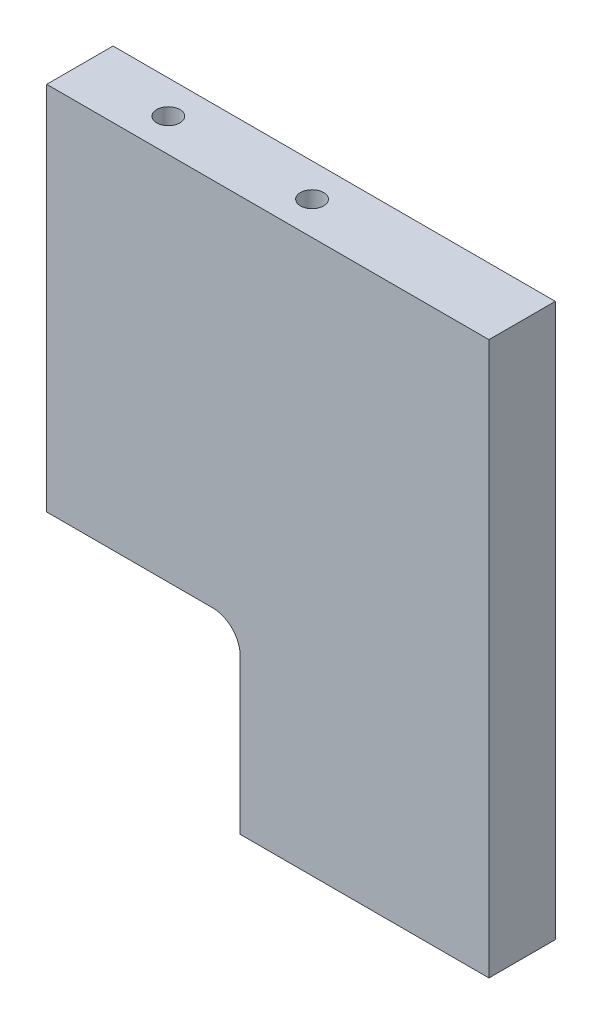
ISO-10303-21;
HEADER;
FILE_DESCRIPTION(('STEP AP214'),'2;1');
FILE_NAME('part.step','',(''),(''),'','','');
FILE_SCHEMA(('AUTOMOTIVE_DESIGN { 1 0 10303 214 1 1 1 1 }'));
ENDSEC;
DATA;
#1=APPLICATION_CONTEXT('core data for automotive mechanical design processes');
#2=APPLICATION_PROTOCOL_DEFINITION('international standard','automotive_design',2000,#1);
#3=PRODUCT_CONTEXT('',#1,'mechanical');
#4=PRODUCT('Part','Part','',(#3));
#5=PRODUCT_RELATED_PRODUCT_CATEGORY('part','',(#4));
#6=PRODUCT_DEFINITION_FORMATION('','',#4);
#7=PRODUCT_DEFINITION_CONTEXT('part definition',#1,'design');
#8=PRODUCT_DEFINITION('design','',#6,#7);
#9=PRODUCT_DEFINITION_SHAPE('','',#8);
#10=(LENGTH_UNIT() NAMED_UNIT(*) SI_UNIT(.MILLI.,.METRE.));
#11=(NAMED_UNIT(*) PLANE_ANGLE_UNIT() SI_UNIT($,.RADIAN.));
#12=(NAMED_UNIT(*) SI_UNIT($,.STERADIAN.) SOLID_ANGLE_UNIT());
#13=UNCERTAINTY_MEASURE_WITH_UNIT(LENGTH_MEASURE(1.E-05),#10,'distance_accuracy_value','');
#14=(GEOMETRIC_REPRESENTATION_CONTEXT(3) GLOBAL_UNCERTAINTY_ASSIGNED_CONTEXT((#13)) GLOBAL_UNIT_ASSIGNED_CONTEXT((#10,
#11,#12)) REPRESENTATION_CONTEXT('',''));
#15=CARTESIAN_POINT('',(0.,0.,0.));
#16=DIRECTION('',(0.,0.,1.));
#17=DIRECTION('',(1.,0.,0.));
#18=AXIS2_PLACEMENT_3D('',#15,#16,#17);
#19=CARTESIAN_POINT('',(0.,100.,12.));
#20=DIRECTION('',(-1.,0.,0.));
#21=DIRECTION('',(0.,0.,1.));
#22=AXIS2_PLACEMENT_3D('',#19,#20,#21);
#23=PLANE('',#22);
#24=DIRECTION('',(0.,1.,0.));
#25=VECTOR('',#24,1.);
#26=CARTESIAN_POINT('',(0.,100.,0.));
#27=LINE('',#26,#25);
#28=CARTESIAN_POINT('',(0.,0.,0.));
#29=VERTEX_POINT('',#28);
#30=CARTESIAN_POINT('',(0.,100.,0.));
#31=VERTEX_POINT('',#30);
#32=EDGE_CURVE('E137',#29,#31,#27,.T.);
#33=ORIENTED_EDGE('',*,*,#32,.T.);
#34=DIRECTION('',(0.,0.,-1.));
#35=VECTOR('',#34,1.);
#36=CARTESIAN_POINT('',(0.,100.,12.));
#37=LINE('',#36,#35);
#38=CARTESIAN_POINT('',(0.,100.,12.));
#39=VERTEX_POINT('',#38);
#40=EDGE_CURVE('E175',#39,#31,#37,.T.);
#41=ORIENTED_EDGE('',*,*,#40,.F.);
#42=DIRECTION('',(0.,1.,0.));
#43=VECTOR('',#42,1.);
#44=CARTESIAN_POINT('',(0.,100.,12.));
#45=LINE('',#44,#43);
#46=CARTESIAN_POINT('',(0.,0.,12.));
#47=VERTEX_POINT('',#46);
#48=EDGE_CURVE('E138',#47,#39,#45,.T.);
#49=ORIENTED_EDGE('',*,*,#48,.F.);
#50=DIRECTION('',(0.,0.,-1.));
#51=VECTOR('',#50,1.);
#52=CARTESIAN_POINT('',(0.,0.,12.));
#53=LINE('',#52,#51);
#54=EDGE_CURVE('E152',#47,#29,#53,.T.);
#55=ORIENTED_EDGE('',*,*,#54,.T.);
#56=EDGE_LOOP('',(#33,#41,#49,#55));
#57=FACE_BOUND('',#56,.T.);
#58=ADVANCED_FACE('F35',(#57),#23,.F.);
#59=CARTESIAN_POINT('',(-80.,100.,12.));
#60=DIRECTION('',(0.,-1.,0.));
#61=DIRECTION('',(0.,0.,-1.));
#62=AXIS2_PLACEMENT_3D('',#59,#60,#61);
#63=PLANE('',#62);
#64=CARTESIAN_POINT('',(-38.,100.,6.00000000000002));
#65=DIRECTION('',(0.,1.,0.));
#66=DIRECTION('',(0.,0.,1.));
#67=AXIS2_PLACEMENT_3D('',#64,#65,#66);
#68=CIRCLE('',#67,2.09999999999999);
#69=CARTESIAN_POINT('',(-38.,100.,8.10000000000001));
#70=VERTEX_POINT('',#69);
#71=EDGE_CURVE('E115',#70,#70,#68,.T.);
#72=ORIENTED_EDGE('',*,*,#71,.F.);
#73=EDGE_LOOP('',(#72));
#74=FACE_BOUND('',#73,.T.);
#75=CARTESIAN_POINT('',(-64.,100.,6.00000000000001));
#76=DIRECTION('',(0.,1.,0.));
#77=DIRECTION('',(0.,0.,1.));
#78=AXIS2_PLACEMENT_3D('',#75,#76,#77);
#79=CIRCLE('',#78,2.09999999999999);
#80=CARTESIAN_POINT('',(-64.,100.,8.1));
#81=VERTEX_POINT('',#80);
#82=EDGE_CURVE('E114',#81,#81,#79,.T.);
#83=ORIENTED_EDGE('',*,*,#82,.F.);
#84=EDGE_LOOP('',(#83));
#85=FACE_BOUND('',#84,.T.);
#86=DIRECTION('',(-1.,0.,0.));
#87=VECTOR('',#86,1.);
#88=CARTESIAN_POINT('',(-80.,100.,0.));
#89=LINE('',#88,#87);
#90=CARTESIAN_POINT('',(-80.,100.,0.));
#91=VERTEX_POINT('',#90);
#92=EDGE_CURVE('E155',#31,#91,#89,.T.);
#93=ORIENTED_EDGE('',*,*,#92,.T.);
#94=DIRECTION('',(0.,0.,-1.));
#95=VECTOR('',#94,1.);
#96=CARTESIAN_POINT('',(-80.,100.,12.));
#97=LINE('',#96,#95);
#98=CARTESIAN_POINT('',(-80.,100.,12.));
#99=VERTEX_POINT('',#98);
#100=EDGE_CURVE('E172',#99,#91,#97,.T.);
#101=ORIENTED_EDGE('',*,*,#100,.F.);
#102=DIRECTION('',(-1.,0.,0.));
#103=VECTOR('',#102,1.);
#104=CARTESIAN_POINT('',(-80.,100.,12.));
#105=LINE('',#104,#103);
#106=EDGE_CURVE('E141',#39,#99,#105,.T.);
#107=ORIENTED_EDGE('',*,*,#106,.F.);
#108=ORIENTED_EDGE('',*,*,#40,.T.);
#109=EDGE_LOOP('',(#93,#101,#107,#108));
#110=FACE_BOUND('',#109,.T.);
#111=ADVANCED_FACE('F212',(#74,#85,#110),#63,.F.);
#112=CARTESIAN_POINT('',(-80.,33.,12.));
#113=DIRECTION('',(1.,0.,0.));
#114=DIRECTION('',(0.,0.,-1.));
#115=AXIS2_PLACEMENT_3D('',#112,#113,#114);
#116=PLANE('',#115);
#117=DIRECTION('',(0.,-1.,0.));
#118=VECTOR('',#117,1.);
#119=CARTESIAN_POINT('',(-80.,33.,0.));
#120=LINE('',#119,#118);
#121=CARTESIAN_POINT('',(-80.,33.,0.));
#122=VERTEX_POINT('',#121);
#123=EDGE_CURVE('E157',#91,#122,#120,.T.);
#124=ORIENTED_EDGE('',*,*,#123,.T.);
#125=DIRECTION('',(0.,0.,-1.));
#126=VECTOR('',#125,1.);
#127=CARTESIAN_POINT('',(-80.,33.,12.));
#128=LINE('',#127,#126);
#129=CARTESIAN_POINT('',(-80.,33.,12.));
#130=VERTEX_POINT('',#129);
#131=EDGE_CURVE('E169',#130,#122,#128,.T.);
#132=ORIENTED_EDGE('',*,*,#131,.F.);
#133=DIRECTION('',(0.,-1.,0.));
#134=VECTOR('',#133,1.);
#135=CARTESIAN_POINT('',(-80.,33.,12.));
#136=LINE('',#135,#134);
#137=EDGE_CURVE('E144',#99,#130,#136,.T.);
#138=ORIENTED_EDGE('',*,*,#137,.F.);
#139=ORIENTED_EDGE('',*,*,#100,.T.);
#140=EDGE_LOOP('',(#124,#132,#138,#139));
#141=FACE_BOUND('',#140,.T.);
#142=ADVANCED_FACE('F217',(#141),#116,.F.);
#143=CARTESIAN_POINT('',(-45.,33.,12.));
#144=DIRECTION('',(0.,1.,0.));
#145=DIRECTION('',(-1.,0.,0.));
#146=AXIS2_PLACEMENT_3D('',#143,#144,#145);
#147=PLANE('',#146);
#148=DIRECTION('',(1.,0.,0.));
#149=VECTOR('',#148,1.);
#150=CARTESIAN_POINT('',(-45.,33.,0.));
#151=LINE('',#150,#149);
#152=CARTESIAN_POINT('',(-50.,33.,0.));
#153=VERTEX_POINT('',#152);
#154=EDGE_CURVE('E159',#122,#153,#151,.T.);
#155=ORIENTED_EDGE('',*,*,#154,.T.);
#156=DIRECTION('',(0.,0.,-1.));
#157=VECTOR('',#156,1.);
#158=CARTESIAN_POINT('',(-50.,33.,12.));
#159=LINE('',#158,#157);
#160=CARTESIAN_POINT('',(-50.,33.,12.));
#161=VERTEX_POINT('',#160);
#162=EDGE_CURVE('E50',#153,#161,#159,.F.);
#163=ORIENTED_EDGE('',*,*,#162,.T.);
#164=DIRECTION('',(1.,0.,0.));
#165=VECTOR('',#164,1.);
#166=CARTESIAN_POINT('',(-45.,33.,12.));
#167=LINE('',#166,#165);
#168=EDGE_CURVE('E146',#130,#161,#167,.T.);
#169=ORIENTED_EDGE('',*,*,#168,.F.);
#170=ORIENTED_EDGE('',*,*,#131,.T.);
#171=EDGE_LOOP('',(#155,#163,#169,#170));
#172=FACE_BOUND('',#171,.T.);
#173=ADVANCED_FACE('F223',(#172),#147,.F.);
#174=CARTESIAN_POINT('',(-45.,0.,12.));
#175=DIRECTION('',(1.,0.,0.));
#176=DIRECTION('',(0.,0.,-1.));
#177=AXIS2_PLACEMENT_3D('',#174,#175,#176);
#178=PLANE('',#177);
#179=DIRECTION('',(0.,-1.,0.));
#180=VECTOR('',#179,1.);
#181=CARTESIAN_POINT('',(-45.,0.,12.));
#182=LINE('',#181,#180);
#183=CARTESIAN_POINT('',(-45.,28.,12.));
#184=VERTEX_POINT('',#183);
#185=CARTESIAN_POINT('',(-45.,0.,12.));
#186=VERTEX_POINT('',#185);
#187=EDGE_CURVE('E148',#184,#186,#182,.T.);
#188=ORIENTED_EDGE('',*,*,#187,.F.);
#189=DIRECTION('',(0.,0.,-1.));
#190=VECTOR('',#189,1.);
#191=CARTESIAN_POINT('',(-45.,28.,0.));
#192=LINE('',#191,#190);
#193=CARTESIAN_POINT('',(-45.,28.,0.));
#194=VERTEX_POINT('',#193);
#195=EDGE_CURVE('E178',#184,#194,#192,.T.);
#196=ORIENTED_EDGE('',*,*,#195,.T.);
#197=DIRECTION('',(0.,-1.,0.));
#198=VECTOR('',#197,1.);
#199=CARTESIAN_POINT('',(-45.,0.,0.));
#200=LINE('',#199,#198);
#201=CARTESIAN_POINT('',(-45.,0.,0.));
#202=VERTEX_POINT('',#201);
#203=EDGE_CURVE('E161',#194,#202,#200,.T.);
#204=ORIENTED_EDGE('',*,*,#203,.T.);
#205=DIRECTION('',(0.,0.,-1.));
#206=VECTOR('',#205,1.);
#207=CARTESIAN_POINT('',(-45.,0.,12.));
#208=LINE('',#207,#206);
#209=EDGE_CURVE('E166',#186,#202,#208,.T.);
#210=ORIENTED_EDGE('',*,*,#209,.F.);
#211=EDGE_LOOP('',(#188,#196,#204,#210));
#212=FACE_BOUND('',#211,.T.);
#213=ADVANCED_FACE('F184',(#212),#178,.F.);
#214=CARTESIAN_POINT('',(0.,0.,12.));
#215=DIRECTION('',(0.,1.,0.));
#216=DIRECTION('',(-1.,0.,0.));
#217=AXIS2_PLACEMENT_3D('',#214,#215,#216);
#218=PLANE('',#217);
#219=CARTESIAN_POINT('',(-6.00000000000011,0.,5.99999999999354));
#220=DIRECTION('',(0.,-1.,0.));
#221=DIRECTION('',(0.,0.,-1.));
#222=AXIS2_PLACEMENT_3D('',#219,#220,#221);
#223=CIRCLE('',#222,2.1);
#224=CARTESIAN_POINT('',(-6.00000000000011,0.,3.89999999999354));
#225=VERTEX_POINT('',#224);
#226=EDGE_CURVE('E125',#225,#225,#223,.T.);
#227=ORIENTED_EDGE('',*,*,#226,.F.);
#228=EDGE_LOOP('',(#227));
#229=FACE_BOUND('',#228,.T.);
#230=CARTESIAN_POINT('',(-21.0000000000001,0.,5.99999999999354));
#231=DIRECTION('',(0.,-1.,0.));
#232=DIRECTION('',(0.,0.,-1.));
#233=AXIS2_PLACEMENT_3D('',#230,#231,#232);
#234=CIRCLE('',#233,2.1);
#235=CARTESIAN_POINT('',(-21.0000000000001,0.,3.89999999999354));
#236=VERTEX_POINT('',#235);
#237=EDGE_CURVE('E131',#236,#236,#234,.T.);
#238=ORIENTED_EDGE('',*,*,#237,.F.);
#239=EDGE_LOOP('',(#238));
#240=FACE_BOUND('',#239,.T.);
#241=DIRECTION('',(1.,0.,0.));
#242=VECTOR('',#241,1.);
#243=CARTESIAN_POINT('',(0.,0.,0.));
#244=LINE('',#243,#242);
#245=EDGE_CURVE('E142',#202,#29,#244,.T.);
#246=ORIENTED_EDGE('',*,*,#245,.T.);
#247=ORIENTED_EDGE('',*,*,#54,.F.);
#248=DIRECTION('',(1.,0.,0.));
#249=VECTOR('',#248,1.);
#250=CARTESIAN_POINT('',(0.,0.,12.));
#251=LINE('',#250,#249);
#252=EDGE_CURVE('E150',#186,#47,#251,.T.);
#253=ORIENTED_EDGE('',*,*,#252,.F.);
#254=ORIENTED_EDGE('',*,*,#209,.T.);
#255=EDGE_LOOP('',(#246,#247,#253,#254));
#256=FACE_BOUND('',#255,.T.);
#257=ADVANCED_FACE('F193',(#229,#240,#256),#218,.F.);
#258=CARTESIAN_POINT('',(0.,0.,12.));
#259=DIRECTION('',(0.,0.,-1.));
#260=DIRECTION('',(-1.,0.,0.));
#261=AXIS2_PLACEMENT_3D('',#258,#259,#260);
#262=PLANE('',#261);
#263=ORIENTED_EDGE('',*,*,#48,.T.);
#264=ORIENTED_EDGE('',*,*,#106,.T.);
#265=ORIENTED_EDGE('',*,*,#137,.T.);
#266=ORIENTED_EDGE('',*,*,#168,.T.);
#267=CARTESIAN_POINT('',(-50.,28.,12.));
#268=DIRECTION('',(0.,0.,-1.));
#269=DIRECTION('',(-1.,0.,0.));
#270=AXIS2_PLACEMENT_3D('',#267,#268,#269);
#271=CIRCLE('',#270,5.);
#272=EDGE_CURVE('E11',#161,#184,#271,.T.);
#273=ORIENTED_EDGE('',*,*,#272,.T.);
#274=ORIENTED_EDGE('',*,*,#187,.T.);
#275=ORIENTED_EDGE('',*,*,#252,.T.);
#276=EDGE_LOOP('',(#263,#264,#265,#266,#273,#274,#275));
#277=FACE_BOUND('',#276,.T.);
#278=ADVANCED_FACE('F199',(#277),#262,.F.);
#279=CARTESIAN_POINT('',(0.,0.,0.));
#280=DIRECTION('',(0.,0.,-1.));
#281=DIRECTION('',(-1.,0.,0.));
#282=AXIS2_PLACEMENT_3D('',#279,#280,#281);
#283=PLANE('',#282);
#284=ORIENTED_EDGE('',*,*,#32,.F.);
#285=ORIENTED_EDGE('',*,*,#245,.F.);
#286=ORIENTED_EDGE('',*,*,#203,.F.);
#287=CARTESIAN_POINT('',(-50.,28.,0.));
#288=DIRECTION('',(0.,0.,-1.));
#289=DIRECTION('',(-1.,0.,0.));
#290=AXIS2_PLACEMENT_3D('',#287,#288,#289);
#291=CIRCLE('',#290,5.);
#292=EDGE_CURVE('E43',#194,#153,#291,.F.);
#293=ORIENTED_EDGE('',*,*,#292,.T.);
#294=ORIENTED_EDGE('',*,*,#154,.F.);
#295=ORIENTED_EDGE('',*,*,#123,.F.);
#296=ORIENTED_EDGE('',*,*,#92,.F.);
#297=EDGE_LOOP('',(#284,#285,#286,#293,#294,#295,#296));
#298=FACE_BOUND('',#297,.T.);
#299=ADVANCED_FACE('F190',(#298),#283,.T.);
#300=CARTESIAN_POINT('',(-50.,28.,12.));
#301=DIRECTION('',(0.,0.,1.));
#302=DIRECTION('',(1.,0.,0.));
#303=AXIS2_PLACEMENT_3D('',#300,#301,#302);
#304=CYLINDRICAL_SURFACE('',#303,5.);
#305=ORIENTED_EDGE('',*,*,#272,.F.);
#306=ORIENTED_EDGE('',*,*,#162,.F.);
#307=ORIENTED_EDGE('',*,*,#292,.F.);
#308=ORIENTED_EDGE('',*,*,#195,.F.);
#309=EDGE_LOOP('',(#305,#306,#307,#308));
#310=FACE_BOUND('',#309,.T.);
#311=ADVANCED_FACE('F37',(#310),#304,.F.);
#312=CARTESIAN_POINT('',(-21.0000000000001,12.4,5.99999999999354));
#313=DIRECTION('',(0.,-1.,0.));
#314=DIRECTION('',(0.,0.,-1.));
#315=AXIS2_PLACEMENT_3D('',#312,#313,#314);
#316=CONICAL_SURFACE('',#315,2.1,1.02974425867665);
#317=CARTESIAN_POINT('',(-21.0000000000001,13.6618072999579,5.99999999999354));
#318=VERTEX_POINT('',#317);
#319=VERTEX_LOOP('',#318);
#320=FACE_BOUND('',#319,.T.);
#321=CARTESIAN_POINT('',(-21.0000000000001,12.4,5.99999999999354));
#322=DIRECTION('',(0.,-1.,0.));
#323=DIRECTION('',(0.,0.,-1.));
#324=AXIS2_PLACEMENT_3D('',#321,#322,#323);
#325=CIRCLE('',#324,2.1);
#326=CARTESIAN_POINT('',(-21.0000000000001,12.4,3.89999999999354));
#327=VERTEX_POINT('',#326);
#328=EDGE_CURVE('E134',#327,#327,#325,.T.);
#329=ORIENTED_EDGE('',*,*,#328,.T.);
#330=EDGE_LOOP('',(#329));
#331=FACE_BOUND('',#330,.T.);
#332=ADVANCED_FACE('F202',(#320,#331),#316,.F.);
#333=CARTESIAN_POINT('',(-21.0000000000001,0.,5.99999999999354));
#334=DIRECTION('',(0.,-1.,0.));
#335=DIRECTION('',(0.,0.,-1.));
#336=AXIS2_PLACEMENT_3D('',#333,#334,#335);
#337=CYLINDRICAL_SURFACE('',#336,2.1);
#338=ORIENTED_EDGE('',*,*,#328,.F.);
#339=EDGE_LOOP('',(#338));
#340=FACE_BOUND('',#339,.T.);
#341=ORIENTED_EDGE('',*,*,#237,.T.);
#342=EDGE_LOOP('',(#341));
#343=FACE_BOUND('',#342,.T.);
#344=ADVANCED_FACE('F207',(#340,#343),#337,.F.);
#345=CARTESIAN_POINT('',(-6.00000000000011,12.4,5.99999999999354));
#346=DIRECTION('',(0.,-1.,0.));
#347=DIRECTION('',(0.,0.,-1.));
#348=AXIS2_PLACEMENT_3D('',#345,#346,#347);
#349=CONICAL_SURFACE('',#348,2.1,1.02974425867665);
#350=CARTESIAN_POINT('',(-6.00000000000011,13.6618072999579,5.99999999999354));
#351=VERTEX_POINT('',#350);
#352=VERTEX_LOOP('',#351);
#353=FACE_BOUND('',#352,.T.);
#354=CARTESIAN_POINT('',(-6.00000000000011,12.4,5.99999999999354));
#355=DIRECTION('',(0.,-1.,0.));
#356=DIRECTION('',(0.,0.,-1.));
#357=AXIS2_PLACEMENT_3D('',#354,#355,#356);
#358=CIRCLE('',#357,2.1);
#359=CARTESIAN_POINT('',(-6.00000000000011,12.4,3.89999999999354));
#360=VERTEX_POINT('',#359);
#361=EDGE_CURVE('E128',#360,#360,#358,.T.);
#362=ORIENTED_EDGE('',*,*,#361,.T.);
#363=EDGE_LOOP('',(#362));
#364=FACE_BOUND('',#363,.T.);
#365=ADVANCED_FACE('F236',(#353,#364),#349,.F.);
#366=CARTESIAN_POINT('',(-6.00000000000011,0.,5.99999999999354));
#367=DIRECTION('',(0.,-1.,0.));
#368=DIRECTION('',(0.,0.,-1.));
#369=AXIS2_PLACEMENT_3D('',#366,#367,#368);
#370=CYLINDRICAL_SURFACE('',#369,2.1);
#371=ORIENTED_EDGE('',*,*,#361,.F.);
#372=EDGE_LOOP('',(#371));
#373=FACE_BOUND('',#372,.T.);
#374=ORIENTED_EDGE('',*,*,#226,.T.);
#375=EDGE_LOOP('',(#374));
#376=FACE_BOUND('',#375,.T.);
#377=ADVANCED_FACE('F240',(#373,#376),#370,.F.);
#378=CARTESIAN_POINT('',(-64.,87.6,6.00000000000001));
#379=DIRECTION('',(0.,1.,0.));
#380=DIRECTION('',(0.,0.,1.));
#381=AXIS2_PLACEMENT_3D('',#378,#379,#380);
#382=CONICAL_SURFACE('',#381,2.09999999999999,1.02974425867666);
#383=CARTESIAN_POINT('',(-64.,86.3381927000421,6.00000000000001));
#384=VERTEX_POINT('',#383);
#385=VERTEX_LOOP('',#384);
#386=FACE_BOUND('',#385,.T.);
#387=CARTESIAN_POINT('',(-64.,87.6,6.00000000000001));
#388=DIRECTION('',(0.,1.,0.));
#389=DIRECTION('',(0.,0.,1.));
#390=AXIS2_PLACEMENT_3D('',#387,#388,#389);
#391=CIRCLE('',#390,2.09999999999999);
#392=CARTESIAN_POINT('',(-64.,87.6,8.1));
#393=VERTEX_POINT('',#392);
#394=EDGE_CURVE('E118',#393,#393,#391,.T.);
#395=ORIENTED_EDGE('',*,*,#394,.T.);
#396=EDGE_LOOP('',(#395));
#397=FACE_BOUND('',#396,.T.);
#398=ADVANCED_FACE('F244',(#386,#397),#382,.F.);
#399=CARTESIAN_POINT('',(-64.,100.,6.00000000000001));
#400=DIRECTION('',(0.,1.,0.));
#401=DIRECTION('',(0.,0.,1.));
#402=AXIS2_PLACEMENT_3D('',#399,#400,#401);
#403=CYLINDRICAL_SURFACE('',#402,2.09999999999999);
#404=ORIENTED_EDGE('',*,*,#394,.F.);
#405=EDGE_LOOP('',(#404));
#406=FACE_BOUND('',#405,.T.);
#407=ORIENTED_EDGE('',*,*,#82,.T.);
#408=EDGE_LOOP('',(#407));
#409=FACE_BOUND('',#408,.T.);
#410=ADVANCED_FACE('F108',(#406,#409),#403,.F.);
#411=CARTESIAN_POINT('',(-38.,87.6,6.00000000000002));
#412=DIRECTION('',(0.,1.,0.));
#413=DIRECTION('',(0.,0.,1.));
#414=AXIS2_PLACEMENT_3D('',#411,#412,#413);
#415=CONICAL_SURFACE('',#414,2.09999999999998,1.02974425867665);
#416=CARTESIAN_POINT('',(-38.,86.3381927000421,6.00000000000002));
#417=VERTEX_POINT('',#416);
#418=VERTEX_LOOP('',#417);
#419=FACE_BOUND('',#418,.T.);
#420=CARTESIAN_POINT('',(-38.,87.6,6.00000000000002));
#421=DIRECTION('',(0.,1.,0.));
#422=DIRECTION('',(0.,0.,1.));
#423=AXIS2_PLACEMENT_3D('',#420,#421,#422);
#424=CIRCLE('',#423,2.09999999999998);
#425=CARTESIAN_POINT('',(-38.,87.6,8.1));
#426=VERTEX_POINT('',#425);
#427=EDGE_CURVE('E112',#426,#426,#424,.T.);
#428=ORIENTED_EDGE('',*,*,#427,.T.);
#429=EDGE_LOOP('',(#428));
#430=FACE_BOUND('',#429,.T.);
#431=ADVANCED_FACE('F104',(#419,#430),#415,.F.);
#432=CARTESIAN_POINT('',(-38.,100.,6.00000000000002));
#433=DIRECTION('',(0.,1.,0.));
#434=DIRECTION('',(0.,0.,1.));
#435=AXIS2_PLACEMENT_3D('',#432,#433,#434);
#436=CYLINDRICAL_SURFACE('',#435,2.09999999999999);
#437=ORIENTED_EDGE('',*,*,#427,.F.);
#438=EDGE_LOOP('',(#437));
#439=FACE_BOUND('',#438,.T.);
#440=ORIENTED_EDGE('',*,*,#71,.T.);
#441=EDGE_LOOP('',(#440));
#442=FACE_BOUND('',#441,.T.);
#443=ADVANCED_FACE('F107',(#439,#442),#436,.F.);
#444=CLOSED_SHELL('',(#58,#111,#142,#173,#213,#257,#278,#299,#311,#332,#344,#365,#377,#398,#410,
#431,#443));
#445=MANIFOLD_SOLID_BREP('B2',#444);
#446=ADVANCED_BREP_SHAPE_REPRESENTATION('',(#18,#445),#14);
#447=SHAPE_DEFINITION_REPRESENTATION(#9,#446);
ENDSEC;
END-ISO-10303-21;
